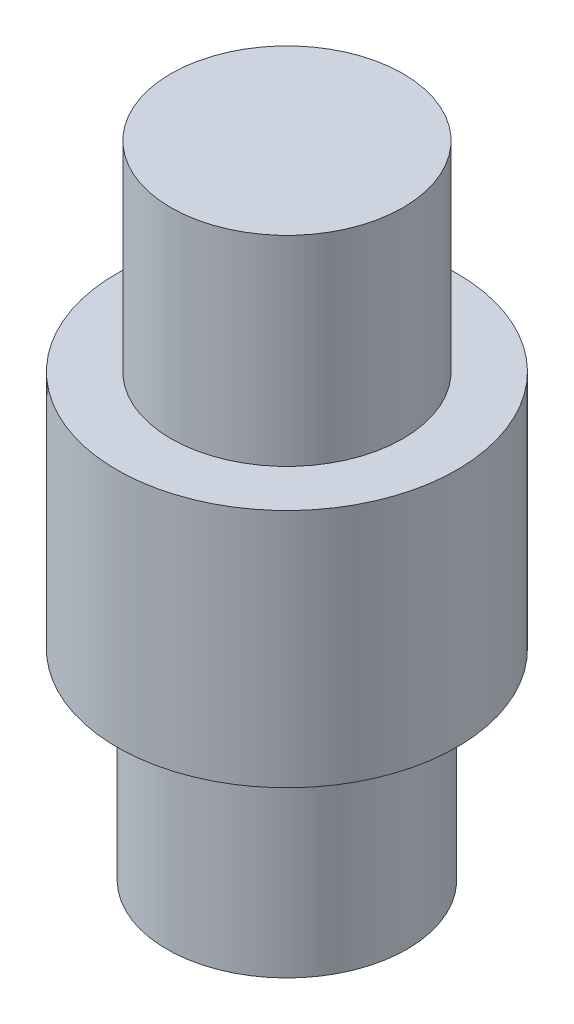
ISO-10303-21;
HEADER;
FILE_DESCRIPTION(('STEP AP214'),'2;1');
FILE_NAME('part.step','',(''),(''),'','','');
FILE_SCHEMA(('AUTOMOTIVE_DESIGN { 1 0 10303 214 1 1 1 1 }'));
ENDSEC;
DATA;
#1=APPLICATION_CONTEXT('core data for automotive mechanical design processes');
#2=APPLICATION_PROTOCOL_DEFINITION('international standard','automotive_design',2000,#1);
#3=PRODUCT_CONTEXT('',#1,'mechanical');
#4=PRODUCT('Part','Part','',(#3));
#5=PRODUCT_RELATED_PRODUCT_CATEGORY('part','',(#4));
#6=PRODUCT_DEFINITION_FORMATION('','',#4);
#7=PRODUCT_DEFINITION_CONTEXT('part definition',#1,'design');
#8=PRODUCT_DEFINITION('design','',#6,#7);
#9=PRODUCT_DEFINITION_SHAPE('','',#8);
#10=(LENGTH_UNIT() NAMED_UNIT(*) SI_UNIT(.MILLI.,.METRE.));
#11=(NAMED_UNIT(*) PLANE_ANGLE_UNIT() SI_UNIT($,.RADIAN.));
#12=(NAMED_UNIT(*) SI_UNIT($,.STERADIAN.) SOLID_ANGLE_UNIT());
#13=UNCERTAINTY_MEASURE_WITH_UNIT(LENGTH_MEASURE(1.E-05),#10,'distance_accuracy_value','');
#14=(GEOMETRIC_REPRESENTATION_CONTEXT(3) GLOBAL_UNCERTAINTY_ASSIGNED_CONTEXT((#13)) GLOBAL_UNIT_ASSIGNED_CONTEXT((#10,
#11,#12)) REPRESENTATION_CONTEXT('',''));
#15=CARTESIAN_POINT('',(0.,0.,0.));
#16=DIRECTION('',(0.,0.,1.));
#17=DIRECTION('',(1.,0.,0.));
#18=AXIS2_PLACEMENT_3D('',#15,#16,#17);
#19=CARTESIAN_POINT('',(0.,-3.,0.));
#20=DIRECTION('',(0.,-1.,0.));
#21=DIRECTION('',(0.,0.,-1.));
#22=AXIS2_PLACEMENT_3D('',#19,#20,#21);
#23=PLANE('',#22);
#24=CARTESIAN_POINT('',(0.,-3.,0.));
#25=DIRECTION('',(0.,-1.,0.));
#26=DIRECTION('',(0.,0.,-1.));
#27=AXIS2_PLACEMENT_3D('',#24,#25,#26);
#28=CIRCLE('',#27,2.125);
#29=CARTESIAN_POINT('',(0.,-3.,-2.125));
#30=VERTEX_POINT('',#29);
#31=EDGE_CURVE('E43',#30,#30,#28,.T.);
#32=ORIENTED_EDGE('',*,*,#31,.T.);
#33=EDGE_LOOP('',(#32));
#34=FACE_BOUND('',#33,.T.);
#35=CARTESIAN_POINT('',(0.,-3.,0.));
#36=DIRECTION('',(0.,-1.,0.));
#37=DIRECTION('',(0.,0.,-1.));
#38=AXIS2_PLACEMENT_3D('',#35,#36,#37);
#39=CIRCLE('',#38,1.5);
#40=CARTESIAN_POINT('',(0.,-3.,-1.5));
#41=VERTEX_POINT('',#40);
#42=EDGE_CURVE('E53',#41,#41,#39,.T.);
#43=ORIENTED_EDGE('',*,*,#42,.F.);
#44=EDGE_LOOP('',(#43));
#45=FACE_BOUND('',#44,.T.);
#46=ADVANCED_FACE('F32',(#34,#45),#23,.T.);
#47=CARTESIAN_POINT('',(0.,2.5,0.));
#48=DIRECTION('',(0.,-1.,0.));
#49=DIRECTION('',(0.,0.,-1.));
#50=AXIS2_PLACEMENT_3D('',#47,#48,#49);
#51=CYLINDRICAL_SURFACE('',#50,1.45);
#52=CARTESIAN_POINT('',(0.,2.5,0.));
#53=DIRECTION('',(0.,1.,0.));
#54=DIRECTION('',(0.,0.,1.));
#55=AXIS2_PLACEMENT_3D('',#52,#53,#54);
#56=CIRCLE('',#55,1.45);
#57=CARTESIAN_POINT('',(0.,2.5,1.45));
#58=VERTEX_POINT('',#57);
#59=EDGE_CURVE('E10',#58,#58,#56,.T.);
#60=ORIENTED_EDGE('',*,*,#59,.F.);
#61=EDGE_LOOP('',(#60));
#62=FACE_BOUND('',#61,.T.);
#63=CARTESIAN_POINT('',(0.,0.,0.));
#64=DIRECTION('',(0.,-1.,0.));
#65=DIRECTION('',(0.,0.,-1.));
#66=AXIS2_PLACEMENT_3D('',#63,#64,#65);
#67=CIRCLE('',#66,1.45);
#68=CARTESIAN_POINT('',(0.,0.,-1.45));
#69=VERTEX_POINT('',#68);
#70=EDGE_CURVE('E39',#69,#69,#67,.T.);
#71=ORIENTED_EDGE('',*,*,#70,.F.);
#72=EDGE_LOOP('',(#71));
#73=FACE_BOUND('',#72,.T.);
#74=ADVANCED_FACE('F34',(#62,#73),#51,.T.);
#75=CARTESIAN_POINT('',(0.,2.5,0.));
#76=DIRECTION('',(0.,1.,0.));
#77=DIRECTION('',(0.,0.,1.));
#78=AXIS2_PLACEMENT_3D('',#75,#76,#77);
#79=PLANE('',#78);
#80=ORIENTED_EDGE('',*,*,#59,.T.);
#81=EDGE_LOOP('',(#80));
#82=FACE_BOUND('',#81,.T.);
#83=ADVANCED_FACE('F74',(#82),#79,.T.);
#84=CARTESIAN_POINT('',(0.,0.,0.));
#85=DIRECTION('',(0.,-1.,0.));
#86=DIRECTION('',(0.,0.,-1.));
#87=AXIS2_PLACEMENT_3D('',#84,#85,#86);
#88=PLANE('',#87);
#89=CARTESIAN_POINT('',(0.,0.,0.));
#90=DIRECTION('',(0.,-1.,0.));
#91=DIRECTION('',(0.,0.,-1.));
#92=AXIS2_PLACEMENT_3D('',#89,#90,#91);
#93=CIRCLE('',#92,2.125);
#94=CARTESIAN_POINT('',(0.,0.,-2.125));
#95=VERTEX_POINT('',#94);
#96=EDGE_CURVE('E47',#95,#95,#93,.T.);
#97=ORIENTED_EDGE('',*,*,#96,.F.);
#98=EDGE_LOOP('',(#97));
#99=FACE_BOUND('',#98,.T.);
#100=ORIENTED_EDGE('',*,*,#70,.T.);
#101=EDGE_LOOP('',(#100));
#102=FACE_BOUND('',#101,.T.);
#103=ADVANCED_FACE('F78',(#99,#102),#88,.F.);
#104=CARTESIAN_POINT('',(0.,-3.,0.));
#105=DIRECTION('',(0.,1.,0.));
#106=DIRECTION('',(0.,0.,1.));
#107=AXIS2_PLACEMENT_3D('',#104,#105,#106);
#108=CYLINDRICAL_SURFACE('',#107,2.125);
#109=ORIENTED_EDGE('',*,*,#31,.F.);
#110=EDGE_LOOP('',(#109));
#111=FACE_BOUND('',#110,.T.);
#112=ORIENTED_EDGE('',*,*,#96,.T.);
#113=EDGE_LOOP('',(#112));
#114=FACE_BOUND('',#113,.T.);
#115=ADVANCED_FACE('F64',(#111,#114),#108,.T.);
#116=CARTESIAN_POINT('',(0.,-5.5,0.));
#117=DIRECTION('',(0.,1.,0.));
#118=DIRECTION('',(0.,0.,1.));
#119=AXIS2_PLACEMENT_3D('',#116,#117,#118);
#120=CYLINDRICAL_SURFACE('',#119,1.5);
#121=CARTESIAN_POINT('',(0.,-5.5,0.));
#122=DIRECTION('',(0.,-1.,0.));
#123=DIRECTION('',(0.,0.,-1.));
#124=AXIS2_PLACEMENT_3D('',#121,#122,#123);
#125=CIRCLE('',#124,1.5);
#126=CARTESIAN_POINT('',(0.,-5.5,-1.5));
#127=VERTEX_POINT('',#126);
#128=EDGE_CURVE('E51',#127,#127,#125,.T.);
#129=ORIENTED_EDGE('',*,*,#128,.F.);
#130=EDGE_LOOP('',(#129));
#131=FACE_BOUND('',#130,.T.);
#132=ORIENTED_EDGE('',*,*,#42,.T.);
#133=EDGE_LOOP('',(#132));
#134=FACE_BOUND('',#133,.T.);
#135=ADVANCED_FACE('F61',(#131,#134),#120,.T.);
#136=CARTESIAN_POINT('',(0.,-5.5,0.));
#137=DIRECTION('',(0.,-1.,0.));
#138=DIRECTION('',(0.,0.,-1.));
#139=AXIS2_PLACEMENT_3D('',#136,#137,#138);
#140=PLANE('',#139);
#141=ORIENTED_EDGE('',*,*,#128,.T.);
#142=EDGE_LOOP('',(#141));
#143=FACE_BOUND('',#142,.T.);
#144=ADVANCED_FACE('F59',(#143),#140,.T.);
#145=CLOSED_SHELL('',(#46,#74,#83,#103,#115,#135,#144));
#146=MANIFOLD_SOLID_BREP('B2',#145);
#147=ADVANCED_BREP_SHAPE_REPRESENTATION('',(#18,#146),#14);
#148=SHAPE_DEFINITION_REPRESENTATION(#9,#147);
ENDSEC;
END-ISO-10303-21;
